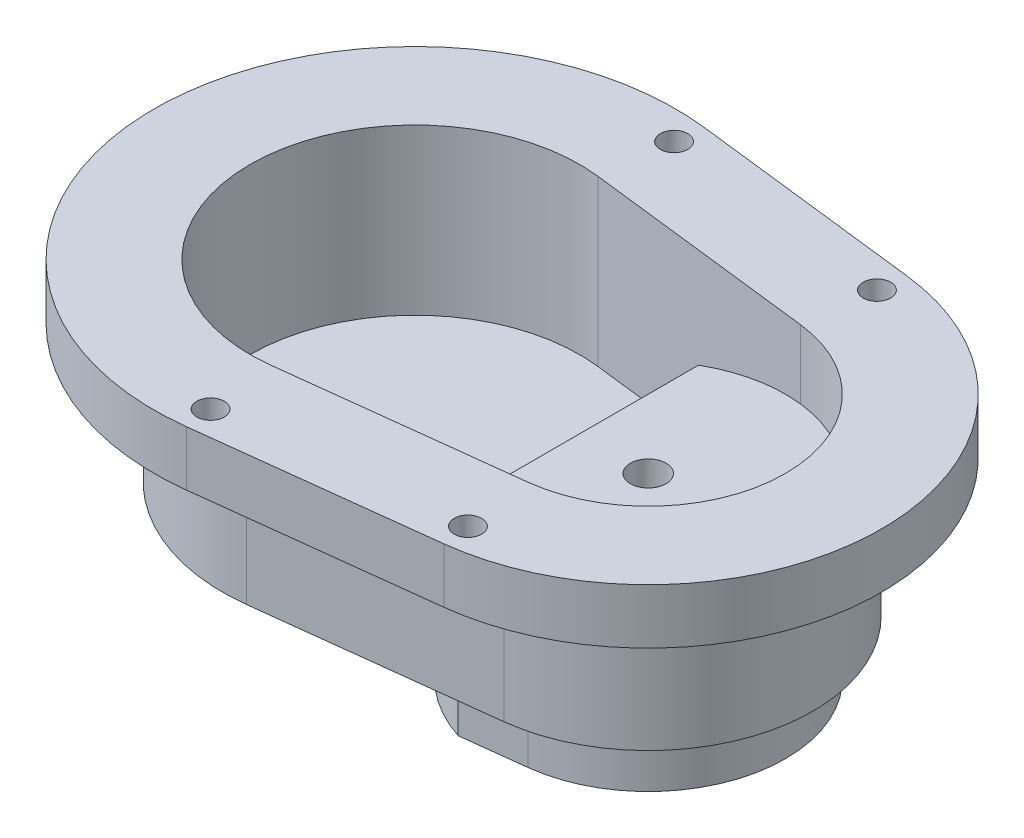
ISO-10303-21;
HEADER;
FILE_DESCRIPTION(('STEP AP214'),'2;1');
FILE_NAME('part.step','',(''),(''),'','','');
FILE_SCHEMA(('AUTOMOTIVE_DESIGN { 1 0 10303 214 1 1 1 1 }'));
ENDSEC;
DATA;
#1=APPLICATION_CONTEXT('core data for automotive mechanical design processes');
#2=APPLICATION_PROTOCOL_DEFINITION('international standard','automotive_design',2000,#1);
#3=PRODUCT_CONTEXT('',#1,'mechanical');
#4=PRODUCT('Part','Part','',(#3));
#5=PRODUCT_RELATED_PRODUCT_CATEGORY('part','',(#4));
#6=PRODUCT_DEFINITION_FORMATION('','',#4);
#7=PRODUCT_DEFINITION_CONTEXT('part definition',#1,'design');
#8=PRODUCT_DEFINITION('design','',#6,#7);
#9=PRODUCT_DEFINITION_SHAPE('','',#8);
#10=(LENGTH_UNIT() NAMED_UNIT(*) SI_UNIT(.MILLI.,.METRE.));
#11=(NAMED_UNIT(*) PLANE_ANGLE_UNIT() SI_UNIT($,.RADIAN.));
#12=(NAMED_UNIT(*) SI_UNIT($,.STERADIAN.) SOLID_ANGLE_UNIT());
#13=UNCERTAINTY_MEASURE_WITH_UNIT(LENGTH_MEASURE(1.E-05),#10,'distance_accuracy_value','');
#14=(GEOMETRIC_REPRESENTATION_CONTEXT(3) GLOBAL_UNCERTAINTY_ASSIGNED_CONTEXT((#13)) GLOBAL_UNIT_ASSIGNED_CONTEXT((#10,
#11,#12)) REPRESENTATION_CONTEXT('',''));
#15=CARTESIAN_POINT('',(0.,0.,0.));
#16=DIRECTION('',(0.,0.,1.));
#17=DIRECTION('',(1.,0.,0.));
#18=AXIS2_PLACEMENT_3D('',#15,#16,#17);
#19=CARTESIAN_POINT('',(85.,45.,0.));
#20=DIRECTION('',(0.,-1.,0.));
#21=DIRECTION('',(0.,0.,-1.));
#22=AXIS2_PLACEMENT_3D('',#19,#20,#21);
#23=CYLINDRICAL_SURFACE('',#22,50.);
#24=DIRECTION('',(0.,1.,0.));
#25=VECTOR('',#24,1.);
#26=CARTESIAN_POINT('',(60.0000000000001,-20.001,-43.301270189222));
#27=LINE('',#26,#25);
#28=CARTESIAN_POINT('',(60.0000000000001,25.,-43.301270189222));
#29=VERTEX_POINT('',#28);
#30=CARTESIAN_POINT('',(60.0000000000001,45.,-43.301270189222));
#31=VERTEX_POINT('',#30);
#32=EDGE_CURVE('E68',#29,#31,#27,.T.);
#33=ORIENTED_EDGE('',*,*,#32,.T.);
#34=CARTESIAN_POINT('',(85.,45.,0.));
#35=DIRECTION('',(0.,1.,0.));
#36=DIRECTION('',(0.,0.,1.));
#37=AXIS2_PLACEMENT_3D('',#34,#35,#36);
#38=CIRCLE('',#37,50.);
#39=CARTESIAN_POINT('',(90.8823529411765,45.,-49.6527735768651));
#40=VERTEX_POINT('',#39);
#41=EDGE_CURVE('E428',#40,#31,#38,.T.);
#42=ORIENTED_EDGE('',*,*,#41,.F.);
#43=DIRECTION('',(0.,1.,0.));
#44=VECTOR('',#43,1.);
#45=CARTESIAN_POINT('',(90.8823529411765,-20.,-49.6527735768651));
#46=LINE('',#45,#44);
#47=CARTESIAN_POINT('',(90.8823529411765,25.,-49.6527735768651));
#48=VERTEX_POINT('',#47);
#49=EDGE_CURVE('E76',#48,#40,#46,.T.);
#50=ORIENTED_EDGE('',*,*,#49,.F.);
#51=CARTESIAN_POINT('',(85.,25.,0.));
#52=DIRECTION('',(0.,1.,0.));
#53=DIRECTION('',(0.,0.,1.));
#54=AXIS2_PLACEMENT_3D('',#51,#52,#53);
#55=CIRCLE('',#54,50.);
#56=EDGE_CURVE('E12',#48,#29,#55,.T.);
#57=ORIENTED_EDGE('',*,*,#56,.T.);
#58=EDGE_LOOP('',(#33,#42,#50,#57));
#59=FACE_BOUND('',#58,.T.);
#60=ADVANCED_FACE('F51',(#59),#23,.T.);
#61=DIRECTION('',(0.,1.,0.));
#62=VECTOR('',#61,1.);
#63=CARTESIAN_POINT('',(60.0000000000001,-20.001,43.301270189222));
#64=LINE('',#63,#62);
#65=CARTESIAN_POINT('',(60.0000000000001,25.,43.301270189222));
#66=VERTEX_POINT('',#65);
#67=CARTESIAN_POINT('',(60.0000000000001,45.,43.301270189222));
#68=VERTEX_POINT('',#67);
#69=EDGE_CURVE('E191',#66,#68,#64,.T.);
#70=ORIENTED_EDGE('',*,*,#69,.F.);
#71=CARTESIAN_POINT('',(90.8823529411765,25.,49.6527735768651));
#72=VERTEX_POINT('',#71);
#73=EDGE_CURVE('E61',#66,#72,#55,.T.);
#74=ORIENTED_EDGE('',*,*,#73,.T.);
#75=DIRECTION('',(0.,1.,0.));
#76=VECTOR('',#75,1.);
#77=CARTESIAN_POINT('',(90.8823529411765,-20.,49.6527735768651));
#78=LINE('',#77,#76);
#79=CARTESIAN_POINT('',(90.8823529411765,45.,49.6527735768651));
#80=VERTEX_POINT('',#79);
#81=EDGE_CURVE('E250',#72,#80,#78,.T.);
#82=ORIENTED_EDGE('',*,*,#81,.T.);
#83=EDGE_CURVE('E202',#68,#80,#38,.T.);
#84=ORIENTED_EDGE('',*,*,#83,.F.);
#85=EDGE_LOOP('',(#70,#74,#82,#84));
#86=FACE_BOUND('',#85,.T.);
#87=ADVANCED_FACE('F199',(#86),#23,.T.);
#88=CARTESIAN_POINT('',(0.,45.,0.));
#89=DIRECTION('',(0.,1.,0.));
#90=DIRECTION('',(0.,0.,1.));
#91=AXIS2_PLACEMENT_3D('',#88,#89,#90);
#92=PLANE('',#91);
#93=CARTESIAN_POINT('',(85.,45.,0.));
#94=DIRECTION('',(0.,1.,0.));
#95=DIRECTION('',(0.,0.,1.));
#96=AXIS2_PLACEMENT_3D('',#93,#94,#95);
#97=CIRCLE('',#96,6.5);
#98=CARTESIAN_POINT('',(85.,45.,6.5));
#99=VERTEX_POINT('',#98);
#100=EDGE_CURVE('E438',#99,#99,#97,.T.);
#101=ORIENTED_EDGE('',*,*,#100,.F.);
#102=EDGE_LOOP('',(#101));
#103=FACE_BOUND('',#102,.T.);
#104=ORIENTED_EDGE('',*,*,#41,.T.);
#105=DIRECTION('',(0.,0.,1.));
#106=VECTOR('',#105,1.);
#107=CARTESIAN_POINT('',(60.0000000000001,45.,0.));
#108=LINE('',#107,#106);
#109=EDGE_CURVE('E446',#31,#68,#108,.T.);
#110=ORIENTED_EDGE('',*,*,#109,.T.);
#111=ORIENTED_EDGE('',*,*,#83,.T.);
#112=EDGE_CURVE('E407',#80,#40,#38,.T.);
#113=ORIENTED_EDGE('',*,*,#112,.T.);
#114=EDGE_LOOP('',(#104,#110,#111,#113));
#115=FACE_BOUND('',#114,.T.);
#116=ADVANCED_FACE('F452',(#103,#115),#92,.T.);
#117=CARTESIAN_POINT('',(85.,25.,0.));
#118=DIRECTION('',(0.,1.,0.));
#119=DIRECTION('',(0.,0.,1.));
#120=AXIS2_PLACEMENT_3D('',#117,#118,#119);
#121=PLANE('',#120);
#122=CARTESIAN_POINT('',(85.,25.,0.));
#123=DIRECTION('',(0.,1.,0.));
#124=DIRECTION('',(0.,0.,1.));
#125=AXIS2_PLACEMENT_3D('',#122,#123,#124);
#126=CIRCLE('',#125,6.5);
#127=CARTESIAN_POINT('',(85.,25.,6.5));
#128=VERTEX_POINT('',#127);
#129=EDGE_CURVE('E55',#128,#128,#126,.T.);
#130=ORIENTED_EDGE('',*,*,#129,.T.);
#131=EDGE_LOOP('',(#130));
#132=FACE_BOUND('',#131,.T.);
#133=DIRECTION('',(0.,0.,-1.));
#134=VECTOR('',#133,1.);
#135=CARTESIAN_POINT('',(60.0000000000001,25.,0.));
#136=LINE('',#135,#134);
#137=EDGE_CURVE('E188',#66,#29,#136,.T.);
#138=ORIENTED_EDGE('',*,*,#137,.T.);
#139=ORIENTED_EDGE('',*,*,#56,.F.);
#140=CARTESIAN_POINT('',(85.,25.,0.));
#141=DIRECTION('',(0.,1.,0.));
#142=DIRECTION('',(0.,0.,1.));
#143=AXIS2_PLACEMENT_3D('',#140,#141,#142);
#144=CIRCLE('',#143,50.);
#145=EDGE_CURVE('E208',#72,#48,#144,.T.);
#146=ORIENTED_EDGE('',*,*,#145,.F.);
#147=ORIENTED_EDGE('',*,*,#73,.F.);
#148=EDGE_LOOP('',(#138,#139,#146,#147));
#149=FACE_BOUND('',#148,.T.);
#150=ADVANCED_FACE('F206',(#132,#149),#121,.F.);
#151=CARTESIAN_POINT('',(8.23529411764709,70.,69.5138830076111));
#152=DIRECTION('',(-0.11764705882353,0.,-0.993055471537302));
#153=DIRECTION('',(-0.993055471537302,0.,0.11764705882353));
#154=AXIS2_PLACEMENT_3D('',#151,#152,#153);
#155=PLANE('',#154);
#156=DIRECTION('',(0.993055471537302,0.,-0.11764705882353));
#157=VECTOR('',#156,1.);
#158=CARTESIAN_POINT('',(8.23529411764708,50.,69.5138830076111));
#159=LINE('',#158,#157);
#160=CARTESIAN_POINT('',(8.23529411764708,50.,69.5138830076111));
#161=VERTEX_POINT('',#160);
#162=CARTESIAN_POINT('',(92.0588235294118,50.,59.5833282922381));
#163=VERTEX_POINT('',#162);
#164=EDGE_CURVE('E385',#161,#163,#159,.T.);
#165=ORIENTED_EDGE('',*,*,#164,.F.);
#166=DIRECTION('',(0.,-1.,0.));
#167=VECTOR('',#166,1.);
#168=CARTESIAN_POINT('',(8.23529411764708,70.,69.5138830076111));
#169=LINE('',#168,#167);
#170=CARTESIAN_POINT('',(8.23529411764708,0.,69.5138830076111));
#171=VERTEX_POINT('',#170);
#172=EDGE_CURVE('E221',#161,#171,#169,.T.);
#173=ORIENTED_EDGE('',*,*,#172,.T.);
#174=DIRECTION('',(0.993055471537302,0.,-0.11764705882353));
#175=VECTOR('',#174,1.);
#176=CARTESIAN_POINT('',(8.23529411764709,0.,69.5138830076111));
#177=LINE('',#176,#175);
#178=CARTESIAN_POINT('',(92.0588235294118,0.,59.5833282922381));
#179=VERTEX_POINT('',#178);
#180=EDGE_CURVE('E236',#171,#179,#177,.T.);
#181=ORIENTED_EDGE('',*,*,#180,.T.);
#182=DIRECTION('',(0.,-1.,0.));
#183=VECTOR('',#182,1.);
#184=CARTESIAN_POINT('',(92.0588235294118,70.,59.5833282922381));
#185=LINE('',#184,#183);
#186=EDGE_CURVE('E211',#163,#179,#185,.T.);
#187=ORIENTED_EDGE('',*,*,#186,.F.);
#188=EDGE_LOOP('',(#165,#173,#181,#187));
#189=FACE_BOUND('',#188,.T.);
#190=ADVANCED_FACE('F53',(#189),#155,.F.);
#191=CARTESIAN_POINT('',(85.,70.,0.));
#192=DIRECTION('',(0.,-1.,0.));
#193=DIRECTION('',(0.,0.,-1.));
#194=AXIS2_PLACEMENT_3D('',#191,#192,#193);
#195=CYLINDRICAL_SURFACE('',#194,60.);
#196=CARTESIAN_POINT('',(85.,50.,0.));
#197=DIRECTION('',(0.,1.,0.));
#198=DIRECTION('',(0.,0.,1.));
#199=AXIS2_PLACEMENT_3D('',#196,#197,#198);
#200=CIRCLE('',#199,60.);
#201=CARTESIAN_POINT('',(92.0588235294118,50.,-59.5833282922381));
#202=VERTEX_POINT('',#201);
#203=EDGE_CURVE('E381',#163,#202,#200,.T.);
#204=ORIENTED_EDGE('',*,*,#203,.F.);
#205=ORIENTED_EDGE('',*,*,#186,.T.);
#206=CARTESIAN_POINT('',(85.,0.,0.));
#207=DIRECTION('',(0.,1.,0.));
#208=DIRECTION('',(0.,0.,1.));
#209=AXIS2_PLACEMENT_3D('',#206,#207,#208);
#210=CIRCLE('',#209,60.);
#211=CARTESIAN_POINT('',(92.0588235294118,0.,-59.5833282922381));
#212=VERTEX_POINT('',#211);
#213=EDGE_CURVE('E232',#179,#212,#210,.T.);
#214=ORIENTED_EDGE('',*,*,#213,.T.);
#215=DIRECTION('',(0.,-1.,0.));
#216=VECTOR('',#215,1.);
#217=CARTESIAN_POINT('',(92.0588235294118,70.,-59.5833282922381));
#218=LINE('',#217,#216);
#219=EDGE_CURVE('E213',#202,#212,#218,.T.);
#220=ORIENTED_EDGE('',*,*,#219,.F.);
#221=EDGE_LOOP('',(#204,#205,#214,#220));
#222=FACE_BOUND('',#221,.T.);
#223=ADVANCED_FACE('F724',(#222),#195,.T.);
#224=CARTESIAN_POINT('',(8.23529411764709,70.,-69.5138830076112));
#225=DIRECTION('',(0.11764705882353,0.,-0.993055471537302));
#226=DIRECTION('',(-0.993055471537302,0.,-0.11764705882353));
#227=AXIS2_PLACEMENT_3D('',#224,#225,#226);
#228=PLANE('',#227);
#229=DIRECTION('',(0.,-1.,0.));
#230=VECTOR('',#229,1.);
#231=CARTESIAN_POINT('',(8.23529411764708,70.,-69.5138830076112));
#232=LINE('',#231,#230);
#233=CARTESIAN_POINT('',(8.23529411764708,50.,-69.5138830076112));
#234=VERTEX_POINT('',#233);
#235=CARTESIAN_POINT('',(8.23529411764708,0.,-69.5138830076112));
#236=VERTEX_POINT('',#235);
#237=EDGE_CURVE('E218',#234,#236,#232,.T.);
#238=ORIENTED_EDGE('',*,*,#237,.F.);
#239=DIRECTION('',(-0.993055471537302,0.,-0.11764705882353));
#240=VECTOR('',#239,1.);
#241=CARTESIAN_POINT('',(8.23529411764708,50.,-69.5138830076112));
#242=LINE('',#241,#240);
#243=EDGE_CURVE('E363',#202,#234,#242,.T.);
#244=ORIENTED_EDGE('',*,*,#243,.F.);
#245=ORIENTED_EDGE('',*,*,#219,.T.);
#246=DIRECTION('',(0.993055471537302,0.,0.11764705882353));
#247=VECTOR('',#246,1.);
#248=CARTESIAN_POINT('',(8.23529411764709,0.,-69.5138830076112));
#249=LINE('',#248,#247);
#250=EDGE_CURVE('E228',#236,#212,#249,.T.);
#251=ORIENTED_EDGE('',*,*,#250,.F.);
#252=EDGE_LOOP('',(#238,#244,#245,#251));
#253=FACE_BOUND('',#252,.T.);
#254=ADVANCED_FACE('F735',(#253),#228,.T.);
#255=CARTESIAN_POINT('',(0.,70.,0.));
#256=DIRECTION('',(0.,-1.,0.));
#257=DIRECTION('',(0.,0.,-1.));
#258=AXIS2_PLACEMENT_3D('',#255,#256,#257);
#259=CYLINDRICAL_SURFACE('',#258,70.);
#260=CARTESIAN_POINT('',(0.,50.,0.));
#261=DIRECTION('',(0.,1.,0.));
#262=DIRECTION('',(0.,0.,1.));
#263=AXIS2_PLACEMENT_3D('',#260,#261,#262);
#264=CIRCLE('',#263,70.);
#265=EDGE_CURVE('E389',#234,#161,#264,.T.);
#266=ORIENTED_EDGE('',*,*,#265,.F.);
#267=ORIENTED_EDGE('',*,*,#237,.T.);
#268=CARTESIAN_POINT('',(0.,0.,0.));
#269=DIRECTION('',(0.,1.,0.));
#270=DIRECTION('',(0.,0.,1.));
#271=AXIS2_PLACEMENT_3D('',#268,#269,#270);
#272=CIRCLE('',#271,70.);
#273=EDGE_CURVE('E224',#236,#171,#272,.T.);
#274=ORIENTED_EDGE('',*,*,#273,.T.);
#275=ORIENTED_EDGE('',*,*,#172,.F.);
#276=EDGE_LOOP('',(#266,#267,#274,#275));
#277=FACE_BOUND('',#276,.T.);
#278=ADVANCED_FACE('F745',(#277),#259,.T.);
#279=CARTESIAN_POINT('',(0.,0.,0.));
#280=DIRECTION('',(0.,1.,0.));
#281=DIRECTION('',(0.,0.,1.));
#282=AXIS2_PLACEMENT_3D('',#279,#280,#281);
#283=PLANE('',#282);
#284=CARTESIAN_POINT('',(85.,0.,0.));
#285=DIRECTION('',(0.,-1.,0.));
#286=DIRECTION('',(0.,0.,-1.));
#287=AXIS2_PLACEMENT_3D('',#284,#285,#286);
#288=CIRCLE('',#287,55.);
#289=CARTESIAN_POINT('',(68.1285936031277,0.,52.3484063386038));
#290=VERTEX_POINT('',#289);
#291=CARTESIAN_POINT('',(68.1285936031277,0.,-52.3484063386038));
#292=VERTEX_POINT('',#291);
#293=EDGE_CURVE('E304',#290,#292,#288,.T.);
#294=ORIENTED_EDGE('',*,*,#293,.F.);
#295=DIRECTION('',(0.993055471537302,0.,-0.11764705882353));
#296=VECTOR('',#295,1.);
#297=CARTESIAN_POINT('',(7.05882352941179,0.,59.5833282922381));
#298=LINE('',#297,#296);
#299=CARTESIAN_POINT('',(90.8823529411764,0.,49.6527735768651));
#300=VERTEX_POINT('',#299);
#301=EDGE_CURVE('E308',#290,#300,#298,.T.);
#302=ORIENTED_EDGE('',*,*,#301,.T.);
#303=CARTESIAN_POINT('',(85.,0.,0.));
#304=DIRECTION('',(0.,-1.,0.));
#305=DIRECTION('',(0.,0.,-1.));
#306=AXIS2_PLACEMENT_3D('',#303,#304,#305);
#307=CIRCLE('',#306,50.);
#308=CARTESIAN_POINT('',(90.8823529411765,0.,-49.6527735768651));
#309=VERTEX_POINT('',#308);
#310=EDGE_CURVE('E295',#300,#309,#307,.F.);
#311=ORIENTED_EDGE('',*,*,#310,.T.);
#312=DIRECTION('',(-0.993055471537302,0.,-0.11764705882353));
#313=VECTOR('',#312,1.);
#314=CARTESIAN_POINT('',(7.0588235294118,0.,-59.5833282922382));
#315=LINE('',#314,#313);
#316=EDGE_CURVE('E300',#309,#292,#315,.T.);
#317=ORIENTED_EDGE('',*,*,#316,.T.);
#318=EDGE_LOOP('',(#294,#302,#311,#317));
#319=FACE_BOUND('',#318,.T.);
#320=ORIENTED_EDGE('',*,*,#180,.F.);
#321=ORIENTED_EDGE('',*,*,#273,.F.);
#322=ORIENTED_EDGE('',*,*,#250,.T.);
#323=ORIENTED_EDGE('',*,*,#213,.F.);
#324=EDGE_LOOP('',(#320,#321,#322,#323));
#325=FACE_BOUND('',#324,.T.);
#326=ADVANCED_FACE('F562',(#319,#325),#283,.F.);
#327=CARTESIAN_POINT('',(7.05882352941179,-20.,59.5833282922381));
#328=DIRECTION('',(0.11764705882353,0.,0.993055471537302));
#329=DIRECTION('',(0.993055471537302,0.,-0.11764705882353));
#330=AXIS2_PLACEMENT_3D('',#327,#328,#329);
#331=PLANE('',#330);
#332=ORIENTED_EDGE('',*,*,#301,.F.);
#333=DIRECTION('',(0.,1.,0.));
#334=VECTOR('',#333,1.);
#335=CARTESIAN_POINT('',(68.1285936031277,-20.,52.3484063386038));
#336=LINE('',#335,#334);
#337=CARTESIAN_POINT('',(68.1285936031277,-20.,52.3484063386038));
#338=VERTEX_POINT('',#337);
#339=EDGE_CURVE('E281',#338,#290,#336,.T.);
#340=ORIENTED_EDGE('',*,*,#339,.F.);
#341=DIRECTION('',(0.993055471537302,0.,-0.11764705882353));
#342=VECTOR('',#341,1.);
#343=CARTESIAN_POINT('',(7.05882352941179,-20.,59.5833282922381));
#344=LINE('',#343,#342);
#345=CARTESIAN_POINT('',(90.8823529411764,-20.,49.6527735768651));
#346=VERTEX_POINT('',#345);
#347=EDGE_CURVE('E327',#338,#346,#344,.T.);
#348=ORIENTED_EDGE('',*,*,#347,.T.);
#349=DIRECTION('',(0.,1.,0.));
#350=VECTOR('',#349,1.);
#351=CARTESIAN_POINT('',(90.8823529411764,-20.,49.6527735768651));
#352=LINE('',#351,#350);
#353=EDGE_CURVE('E291',#346,#300,#352,.T.);
#354=ORIENTED_EDGE('',*,*,#353,.T.);
#355=EDGE_LOOP('',(#332,#340,#348,#354));
#356=FACE_BOUND('',#355,.T.);
#357=ADVANCED_FACE('F558',(#356),#331,.T.);
#358=CARTESIAN_POINT('',(85.,-20.,0.));
#359=DIRECTION('',(0.,1.,0.));
#360=DIRECTION('',(0.,0.,1.));
#361=AXIS2_PLACEMENT_3D('',#358,#359,#360);
#362=CYLINDRICAL_SURFACE('',#361,55.);
#363=ORIENTED_EDGE('',*,*,#293,.T.);
#364=DIRECTION('',(0.,1.,0.));
#365=VECTOR('',#364,1.);
#366=CARTESIAN_POINT('',(68.1285936031277,-20.,-52.3484063386038));
#367=LINE('',#366,#365);
#368=CARTESIAN_POINT('',(68.1285936031277,-20.,-52.3484063386038));
#369=VERTEX_POINT('',#368);
#370=EDGE_CURVE('E284',#369,#292,#367,.T.);
#371=ORIENTED_EDGE('',*,*,#370,.F.);
#372=CARTESIAN_POINT('',(85.,-20.,0.));
#373=DIRECTION('',(0.,-1.,0.));
#374=DIRECTION('',(0.,0.,-1.));
#375=AXIS2_PLACEMENT_3D('',#372,#373,#374);
#376=CIRCLE('',#375,55.);
#377=EDGE_CURVE('E324',#338,#369,#376,.T.);
#378=ORIENTED_EDGE('',*,*,#377,.F.);
#379=ORIENTED_EDGE('',*,*,#339,.T.);
#380=EDGE_LOOP('',(#363,#371,#378,#379));
#381=FACE_BOUND('',#380,.T.);
#382=ADVANCED_FACE('F554',(#381),#362,.T.);
#383=CARTESIAN_POINT('',(7.0588235294118,-20.,-59.5833282922382));
#384=DIRECTION('',(0.11764705882353,0.,-0.993055471537302));
#385=DIRECTION('',(-0.993055471537302,0.,-0.11764705882353));
#386=AXIS2_PLACEMENT_3D('',#383,#384,#385);
#387=PLANE('',#386);
#388=ORIENTED_EDGE('',*,*,#316,.F.);
#389=DIRECTION('',(0.,1.,0.));
#390=VECTOR('',#389,1.);
#391=CARTESIAN_POINT('',(90.8823529411765,-20.,-49.6527735768651));
#392=LINE('',#391,#390);
#393=CARTESIAN_POINT('',(90.8823529411765,-20.,-49.6527735768651));
#394=VERTEX_POINT('',#393);
#395=EDGE_CURVE('E287',#394,#309,#392,.T.);
#396=ORIENTED_EDGE('',*,*,#395,.F.);
#397=DIRECTION('',(-0.993055471537302,0.,-0.11764705882353));
#398=VECTOR('',#397,1.);
#399=CARTESIAN_POINT('',(7.0588235294118,-20.,-59.5833282922382));
#400=LINE('',#399,#398);
#401=EDGE_CURVE('E320',#394,#369,#400,.T.);
#402=ORIENTED_EDGE('',*,*,#401,.T.);
#403=ORIENTED_EDGE('',*,*,#370,.T.);
#404=EDGE_LOOP('',(#388,#396,#402,#403));
#405=FACE_BOUND('',#404,.T.);
#406=ADVANCED_FACE('F551',(#405),#387,.T.);
#407=CARTESIAN_POINT('',(85.,-20.,0.));
#408=DIRECTION('',(0.,1.,0.));
#409=DIRECTION('',(0.,0.,1.));
#410=AXIS2_PLACEMENT_3D('',#407,#408,#409);
#411=CYLINDRICAL_SURFACE('',#410,45.);
#412=CARTESIAN_POINT('',(85.,-20.,0.));
#413=DIRECTION('',(0.,-1.,0.));
#414=DIRECTION('',(0.,0.,-1.));
#415=AXIS2_PLACEMENT_3D('',#412,#413,#414);
#416=CIRCLE('',#415,45.);
#417=CARTESIAN_POINT('',(85.,-20.,-45.));
#418=VERTEX_POINT('',#417);
#419=EDGE_CURVE('E299',#418,#418,#416,.T.);
#420=ORIENTED_EDGE('',*,*,#419,.T.);
#421=EDGE_LOOP('',(#420));
#422=FACE_BOUND('',#421,.T.);
#423=CARTESIAN_POINT('',(85.,0.,0.));
#424=DIRECTION('',(0.,-1.,0.));
#425=DIRECTION('',(0.,0.,-1.));
#426=AXIS2_PLACEMENT_3D('',#423,#424,#425);
#427=CIRCLE('',#426,45.);
#428=CARTESIAN_POINT('',(85.,0.,-45.));
#429=VERTEX_POINT('',#428);
#430=EDGE_CURVE('E312',#429,#429,#427,.T.);
#431=ORIENTED_EDGE('',*,*,#430,.F.);
#432=EDGE_LOOP('',(#431));
#433=FACE_BOUND('',#432,.T.);
#434=ADVANCED_FACE('F549',(#422,#433),#411,.F.);
#435=CARTESIAN_POINT('',(85.,-20.,0.));
#436=DIRECTION('',(0.,1.,0.));
#437=DIRECTION('',(0.,0.,1.));
#438=AXIS2_PLACEMENT_3D('',#435,#436,#437);
#439=CYLINDRICAL_SURFACE('',#438,50.);
#440=ORIENTED_EDGE('',*,*,#310,.F.);
#441=ORIENTED_EDGE('',*,*,#353,.F.);
#442=CARTESIAN_POINT('',(85.,-20.,0.));
#443=DIRECTION('',(0.,-1.,0.));
#444=DIRECTION('',(0.,0.,-1.));
#445=AXIS2_PLACEMENT_3D('',#442,#443,#444);
#446=CIRCLE('',#445,50.);
#447=EDGE_CURVE('E294',#346,#394,#446,.F.);
#448=ORIENTED_EDGE('',*,*,#447,.T.);
#449=ORIENTED_EDGE('',*,*,#395,.T.);
#450=EDGE_LOOP('',(#440,#441,#448,#449));
#451=FACE_BOUND('',#450,.T.);
#452=ADVANCED_FACE('F545',(#451),#439,.T.);
#453=CARTESIAN_POINT('',(0.,-20.,0.));
#454=DIRECTION('',(0.,-1.,0.));
#455=DIRECTION('',(0.,0.,-1.));
#456=AXIS2_PLACEMENT_3D('',#453,#454,#455);
#457=PLANE('',#456);
#458=ORIENTED_EDGE('',*,*,#419,.F.);
#459=EDGE_LOOP('',(#458));
#460=FACE_BOUND('',#459,.T.);
#461=ORIENTED_EDGE('',*,*,#347,.F.);
#462=ORIENTED_EDGE('',*,*,#377,.T.);
#463=ORIENTED_EDGE('',*,*,#401,.F.);
#464=ORIENTED_EDGE('',*,*,#447,.F.);
#465=EDGE_LOOP('',(#461,#462,#463,#464));
#466=FACE_BOUND('',#465,.T.);
#467=ADVANCED_FACE('F542',(#460,#466),#457,.T.);
#468=CARTESIAN_POINT('',(85.,0.,0.));
#469=DIRECTION('',(0.,-1.,0.));
#470=DIRECTION('',(0.,0.,-1.));
#471=AXIS2_PLACEMENT_3D('',#468,#469,#470);
#472=CIRCLE('',#471,6.5);
#473=CARTESIAN_POINT('',(85.,0.,-6.5));
#474=VERTEX_POINT('',#473);
#475=EDGE_CURVE('E442',#474,#474,#472,.T.);
#476=ORIENTED_EDGE('',*,*,#475,.F.);
#477=EDGE_LOOP('',(#476));
#478=FACE_BOUND('',#477,.T.);
#479=ORIENTED_EDGE('',*,*,#430,.T.);
#480=EDGE_LOOP('',(#479));
#481=FACE_BOUND('',#480,.T.);
#482=ADVANCED_FACE('F540',(#478,#481),#283,.F.);
#483=CARTESIAN_POINT('',(0.,50.,0.));
#484=DIRECTION('',(0.,1.,0.));
#485=DIRECTION('',(0.,0.,1.));
#486=AXIS2_PLACEMENT_3D('',#483,#484,#485);
#487=CYLINDRICAL_SURFACE('',#486,95.);
#488=CARTESIAN_POINT('',(0.,70.,0.));
#489=DIRECTION('',(0.,1.,0.));
#490=DIRECTION('',(0.,0.,1.));
#491=AXIS2_PLACEMENT_3D('',#488,#489,#490);
#492=CIRCLE('',#491,95.);
#493=CARTESIAN_POINT('',(11.1764705882353,70.,-94.3402697960437));
#494=VERTEX_POINT('',#493);
#495=CARTESIAN_POINT('',(11.1764705882353,70.,94.3402697960437));
#496=VERTEX_POINT('',#495);
#497=EDGE_CURVE('E359',#494,#496,#492,.T.);
#498=ORIENTED_EDGE('',*,*,#497,.F.);
#499=DIRECTION('',(0.,1.,0.));
#500=VECTOR('',#499,1.);
#501=CARTESIAN_POINT('',(11.1764705882353,50.,-94.3402697960437));
#502=LINE('',#501,#500);
#503=CARTESIAN_POINT('',(11.1764705882353,50.,-94.3402697960437));
#504=VERTEX_POINT('',#503);
#505=EDGE_CURVE('E316',#504,#494,#502,.T.);
#506=ORIENTED_EDGE('',*,*,#505,.F.);
#507=CARTESIAN_POINT('',(0.,50.,0.));
#508=DIRECTION('',(0.,1.,0.));
#509=DIRECTION('',(0.,0.,1.));
#510=AXIS2_PLACEMENT_3D('',#507,#508,#509);
#511=CIRCLE('',#510,95.);
#512=CARTESIAN_POINT('',(11.1764705882353,50.,94.3402697960437));
#513=VERTEX_POINT('',#512);
#514=EDGE_CURVE('E350',#504,#513,#511,.T.);
#515=ORIENTED_EDGE('',*,*,#514,.T.);
#516=DIRECTION('',(0.,1.,0.));
#517=VECTOR('',#516,1.);
#518=CARTESIAN_POINT('',(11.1764705882353,50.,94.3402697960437));
#519=LINE('',#518,#517);
#520=EDGE_CURVE('E334',#513,#496,#519,.T.);
#521=ORIENTED_EDGE('',*,*,#520,.T.);
#522=EDGE_LOOP('',(#498,#506,#515,#521));
#523=FACE_BOUND('',#522,.T.);
#524=ADVANCED_FACE('F530',(#523),#487,.T.);
#525=CARTESIAN_POINT('',(11.1764705882353,50.,-94.3402697960437));
#526=DIRECTION('',(0.11764705882353,0.,-0.993055471537302));
#527=DIRECTION('',(-0.993055471537302,0.,-0.11764705882353));
#528=AXIS2_PLACEMENT_3D('',#525,#526,#527);
#529=PLANE('',#528);
#530=DIRECTION('',(-0.993055471537302,0.,-0.11764705882353));
#531=VECTOR('',#530,1.);
#532=CARTESIAN_POINT('',(11.1764705882353,70.,-94.3402697960437));
#533=LINE('',#532,#531);
#534=CARTESIAN_POINT('',(95.,70.,-84.4097150806707));
#535=VERTEX_POINT('',#534);
#536=EDGE_CURVE('E346',#535,#494,#533,.T.);
#537=ORIENTED_EDGE('',*,*,#536,.F.);
#538=DIRECTION('',(0.,1.,0.));
#539=VECTOR('',#538,1.);
#540=CARTESIAN_POINT('',(95.,50.,-84.4097150806707));
#541=LINE('',#540,#539);
#542=CARTESIAN_POINT('',(95.,50.,-84.4097150806707));
#543=VERTEX_POINT('',#542);
#544=EDGE_CURVE('E341',#543,#535,#541,.T.);
#545=ORIENTED_EDGE('',*,*,#544,.F.);
#546=DIRECTION('',(-0.993055471537302,0.,-0.11764705882353));
#547=VECTOR('',#546,1.);
#548=CARTESIAN_POINT('',(11.1764705882353,50.,-94.3402697960437));
#549=LINE('',#548,#547);
#550=EDGE_CURVE('E338',#543,#504,#549,.T.);
#551=ORIENTED_EDGE('',*,*,#550,.T.);
#552=ORIENTED_EDGE('',*,*,#505,.T.);
#553=EDGE_LOOP('',(#537,#545,#551,#552));
#554=FACE_BOUND('',#553,.T.);
#555=ADVANCED_FACE('F526',(#554),#529,.T.);
#556=CARTESIAN_POINT('',(85.,50.,0.));
#557=DIRECTION('',(0.,1.,0.));
#558=DIRECTION('',(0.,0.,1.));
#559=AXIS2_PLACEMENT_3D('',#556,#557,#558);
#560=CYLINDRICAL_SURFACE('',#559,85.);
#561=CARTESIAN_POINT('',(85.,70.,0.));
#562=DIRECTION('',(0.,1.,0.));
#563=DIRECTION('',(0.,0.,1.));
#564=AXIS2_PLACEMENT_3D('',#561,#562,#563);
#565=CIRCLE('',#564,85.);
#566=CARTESIAN_POINT('',(95.,70.,84.4097150806707));
#567=VERTEX_POINT('',#566);
#568=EDGE_CURVE('E351',#567,#535,#565,.T.);
#569=ORIENTED_EDGE('',*,*,#568,.F.);
#570=DIRECTION('',(0.,1.,0.));
#571=VECTOR('',#570,1.);
#572=CARTESIAN_POINT('',(95.,50.,84.4097150806707));
#573=LINE('',#572,#571);
#574=CARTESIAN_POINT('',(95.,50.,84.4097150806707));
#575=VERTEX_POINT('',#574);
#576=EDGE_CURVE('E337',#575,#567,#573,.T.);
#577=ORIENTED_EDGE('',*,*,#576,.F.);
#578=CARTESIAN_POINT('',(85.,50.,0.));
#579=DIRECTION('',(0.,1.,0.));
#580=DIRECTION('',(0.,0.,1.));
#581=AXIS2_PLACEMENT_3D('',#578,#579,#580);
#582=CIRCLE('',#581,85.);
#583=EDGE_CURVE('E367',#575,#543,#582,.T.);
#584=ORIENTED_EDGE('',*,*,#583,.T.);
#585=ORIENTED_EDGE('',*,*,#544,.T.);
#586=EDGE_LOOP('',(#569,#577,#584,#585));
#587=FACE_BOUND('',#586,.T.);
#588=ADVANCED_FACE('F529',(#587),#560,.T.);
#589=CARTESIAN_POINT('',(11.1764705882353,50.,94.3402697960437));
#590=DIRECTION('',(0.11764705882353,0.,0.993055471537302));
#591=DIRECTION('',(0.993055471537302,0.,-0.11764705882353));
#592=AXIS2_PLACEMENT_3D('',#589,#590,#591);
#593=PLANE('',#592);
#594=DIRECTION('',(0.993055471537302,0.,-0.11764705882353));
#595=VECTOR('',#594,1.);
#596=CARTESIAN_POINT('',(11.1764705882353,70.,94.3402697960437));
#597=LINE('',#596,#595);
#598=EDGE_CURVE('E355',#496,#567,#597,.T.);
#599=ORIENTED_EDGE('',*,*,#598,.F.);
#600=ORIENTED_EDGE('',*,*,#520,.F.);
#601=DIRECTION('',(0.993055471537302,0.,-0.11764705882353));
#602=VECTOR('',#601,1.);
#603=CARTESIAN_POINT('',(11.1764705882353,50.,94.3402697960437));
#604=LINE('',#603,#602);
#605=EDGE_CURVE('E371',#513,#575,#604,.T.);
#606=ORIENTED_EDGE('',*,*,#605,.T.);
#607=ORIENTED_EDGE('',*,*,#576,.T.);
#608=EDGE_LOOP('',(#599,#600,#606,#607));
#609=FACE_BOUND('',#608,.T.);
#610=ADVANCED_FACE('F524',(#609),#593,.T.);
#611=CARTESIAN_POINT('',(0.,50.,0.));
#612=DIRECTION('',(0.,1.,0.));
#613=DIRECTION('',(0.,0.,1.));
#614=AXIS2_PLACEMENT_3D('',#611,#612,#613);
#615=PLANE('',#614);
#616=CARTESIAN_POINT('',(93.8235294117647,50.,-74.4791603652977));
#617=DIRECTION('',(0.,-1.,0.));
#618=DIRECTION('',(0.,0.,-1.));
#619=AXIS2_PLACEMENT_3D('',#616,#617,#618);
#620=CIRCLE('',#619,5.00000000000001);
#621=CARTESIAN_POINT('',(93.8235294117647,50.,-79.4791603652977));
#622=VERTEX_POINT('',#621);
#623=EDGE_CURVE('E402',#622,#622,#620,.T.);
#624=ORIENTED_EDGE('',*,*,#623,.F.);
#625=EDGE_LOOP('',(#624));
#626=FACE_BOUND('',#625,.T.);
#627=CARTESIAN_POINT('',(10.,50.,-84.4097150806707));
#628=DIRECTION('',(0.,-1.,0.));
#629=DIRECTION('',(0.,0.,-1.));
#630=AXIS2_PLACEMENT_3D('',#627,#628,#629);
#631=CIRCLE('',#630,5.);
#632=CARTESIAN_POINT('',(10.,50.,-89.4097150806707));
#633=VERTEX_POINT('',#632);
#634=EDGE_CURVE('E411',#633,#633,#631,.T.);
#635=ORIENTED_EDGE('',*,*,#634,.F.);
#636=EDGE_LOOP('',(#635));
#637=FACE_BOUND('',#636,.T.);
#638=CARTESIAN_POINT('',(10.,50.,84.4097150806707));
#639=DIRECTION('',(0.,-1.,0.));
#640=DIRECTION('',(0.,0.,-1.));
#641=AXIS2_PLACEMENT_3D('',#638,#639,#640);
#642=CIRCLE('',#641,5.);
#643=CARTESIAN_POINT('',(10.,50.,79.4097150806707));
#644=VERTEX_POINT('',#643);
#645=EDGE_CURVE('E419',#644,#644,#642,.T.);
#646=ORIENTED_EDGE('',*,*,#645,.F.);
#647=EDGE_LOOP('',(#646));
#648=FACE_BOUND('',#647,.T.);
#649=CARTESIAN_POINT('',(93.8235294117647,50.,74.4791603652976));
#650=DIRECTION('',(0.,-1.,0.));
#651=DIRECTION('',(0.,0.,-1.));
#652=AXIS2_PLACEMENT_3D('',#649,#650,#651);
#653=CIRCLE('',#652,5.00000000000001);
#654=CARTESIAN_POINT('',(93.8235294117647,50.,69.4791603652976));
#655=VERTEX_POINT('',#654);
#656=EDGE_CURVE('E394',#655,#655,#653,.T.);
#657=ORIENTED_EDGE('',*,*,#656,.F.);
#658=EDGE_LOOP('',(#657));
#659=FACE_BOUND('',#658,.T.);
#660=ORIENTED_EDGE('',*,*,#243,.T.);
#661=ORIENTED_EDGE('',*,*,#265,.T.);
#662=ORIENTED_EDGE('',*,*,#164,.T.);
#663=ORIENTED_EDGE('',*,*,#203,.T.);
#664=EDGE_LOOP('',(#660,#661,#662,#663));
#665=FACE_BOUND('',#664,.T.);
#666=ORIENTED_EDGE('',*,*,#514,.F.);
#667=ORIENTED_EDGE('',*,*,#550,.F.);
#668=ORIENTED_EDGE('',*,*,#583,.F.);
#669=ORIENTED_EDGE('',*,*,#605,.F.);
#670=EDGE_LOOP('',(#666,#667,#668,#669));
#671=FACE_BOUND('',#670,.T.);
#672=ADVANCED_FACE('F521',(#626,#637,#648,#659,#665,#671),#615,.F.);
#673=CARTESIAN_POINT('',(85.,10.,0.));
#674=DIRECTION('',(0.,-1.,0.));
#675=DIRECTION('',(0.,0.,-1.));
#676=AXIS2_PLACEMENT_3D('',#673,#674,#675);
#677=PLANE('',#676);
#678=CARTESIAN_POINT('',(85.,10.,0.));
#679=DIRECTION('',(0.,-1.,0.));
#680=DIRECTION('',(0.,0.,-1.));
#681=AXIS2_PLACEMENT_3D('',#678,#679,#680);
#682=CIRCLE('',#681,6.5);
#683=CARTESIAN_POINT('',(85.,10.,-6.5));
#684=VERTEX_POINT('',#683);
#685=EDGE_CURVE('E432',#684,#684,#682,.T.);
#686=ORIENTED_EDGE('',*,*,#685,.T.);
#687=EDGE_LOOP('',(#686));
#688=FACE_BOUND('',#687,.T.);
#689=DIRECTION('',(-0.993055471537302,0.,0.11764705882353));
#690=VECTOR('',#689,1.);
#691=CARTESIAN_POINT('',(7.05882352941178,10.,59.5833282922381));
#692=LINE('',#691,#690);
#693=CARTESIAN_POINT('',(90.8823529411764,10.,49.6527735768651));
#694=VERTEX_POINT('',#693);
#695=CARTESIAN_POINT('',(7.05882352941178,9.99999999999999,59.5833282922381));
#696=VERTEX_POINT('',#695);
#697=EDGE_CURVE('E278',#694,#696,#692,.T.);
#698=ORIENTED_EDGE('',*,*,#697,.F.);
#699=CARTESIAN_POINT('',(85.,10.,0.));
#700=DIRECTION('',(0.,1.,0.));
#701=DIRECTION('',(0.,0.,1.));
#702=AXIS2_PLACEMENT_3D('',#699,#700,#701);
#703=CIRCLE('',#702,50.);
#704=CARTESIAN_POINT('',(90.8823529411765,10.,-49.6527735768651));
#705=VERTEX_POINT('',#704);
#706=EDGE_CURVE('E429',#694,#705,#703,.T.);
#707=ORIENTED_EDGE('',*,*,#706,.T.);
#708=DIRECTION('',(0.993055471537302,0.,0.11764705882353));
#709=VECTOR('',#708,1.);
#710=CARTESIAN_POINT('',(90.8823529411765,10.,-49.6527735768651));
#711=LINE('',#710,#709);
#712=CARTESIAN_POINT('',(7.05882352941178,9.99999999999999,-59.5833282922382));
#713=VERTEX_POINT('',#712);
#714=EDGE_CURVE('E271',#713,#705,#711,.T.);
#715=ORIENTED_EDGE('',*,*,#714,.F.);
#716=CARTESIAN_POINT('',(0.,10.,0.));
#717=DIRECTION('',(0.,-1.,0.));
#718=DIRECTION('',(0.,0.,-1.));
#719=AXIS2_PLACEMENT_3D('',#716,#717,#718);
#720=CIRCLE('',#719,60.);
#721=EDGE_CURVE('E275',#696,#713,#720,.T.);
#722=ORIENTED_EDGE('',*,*,#721,.F.);
#723=EDGE_LOOP('',(#698,#707,#715,#722));
#724=FACE_BOUND('',#723,.T.);
#725=ADVANCED_FACE('F467',(#688,#724),#677,.F.);
#726=CARTESIAN_POINT('',(7.05882352941178,-20.,59.5833282922381));
#727=DIRECTION('',(0.11764705882353,0.,0.993055471537302));
#728=DIRECTION('',(0.993055471537302,0.,-0.11764705882353));
#729=AXIS2_PLACEMENT_3D('',#726,#727,#728);
#730=PLANE('',#729);
#731=ORIENTED_EDGE('',*,*,#697,.T.);
#732=DIRECTION('',(0.,1.,0.));
#733=VECTOR('',#732,1.);
#734=CARTESIAN_POINT('',(7.05882352941178,-20.,59.5833282922381));
#735=LINE('',#734,#733);
#736=CARTESIAN_POINT('',(7.05882352941178,70.,59.5833282922381));
#737=VERTEX_POINT('',#736);
#738=EDGE_CURVE('E241',#696,#737,#735,.T.);
#739=ORIENTED_EDGE('',*,*,#738,.T.);
#740=DIRECTION('',(0.993055471537302,0.,-0.11764705882353));
#741=VECTOR('',#740,1.);
#742=CARTESIAN_POINT('',(7.05882352941178,70.,59.5833282922381));
#743=LINE('',#742,#741);
#744=CARTESIAN_POINT('',(90.8823529411765,70.,49.6527735768651));
#745=VERTEX_POINT('',#744);
#746=EDGE_CURVE('E263',#737,#745,#743,.T.);
#747=ORIENTED_EDGE('',*,*,#746,.T.);
#748=EDGE_CURVE('E244',#80,#745,#78,.T.);
#749=ORIENTED_EDGE('',*,*,#748,.F.);
#750=ORIENTED_EDGE('',*,*,#81,.F.);
#751=EDGE_CURVE('E246',#694,#72,#78,.T.);
#752=ORIENTED_EDGE('',*,*,#751,.F.);
#753=EDGE_LOOP('',(#731,#739,#747,#749,#750,#752));
#754=FACE_BOUND('',#753,.T.);
#755=ADVANCED_FACE('F462',(#754),#730,.F.);
#756=CARTESIAN_POINT('',(85.,-20.,0.));
#757=DIRECTION('',(0.,1.,0.));
#758=DIRECTION('',(0.,0.,1.));
#759=AXIS2_PLACEMENT_3D('',#756,#757,#758);
#760=CYLINDRICAL_SURFACE('',#759,50.);
#761=CARTESIAN_POINT('',(90.8823529411765,70.,-49.6527735768651));
#762=VERTEX_POINT('',#761);
#763=EDGE_CURVE('E249',#40,#762,#46,.T.);
#764=ORIENTED_EDGE('',*,*,#763,.F.);
#765=ORIENTED_EDGE('',*,*,#112,.F.);
#766=ORIENTED_EDGE('',*,*,#748,.T.);
#767=CARTESIAN_POINT('',(85.,70.,0.));
#768=DIRECTION('',(0.,1.,0.));
#769=DIRECTION('',(0.,0.,1.));
#770=AXIS2_PLACEMENT_3D('',#767,#768,#769);
#771=CIRCLE('',#770,50.);
#772=EDGE_CURVE('E259',#745,#762,#771,.T.);
#773=ORIENTED_EDGE('',*,*,#772,.T.);
#774=EDGE_LOOP('',(#764,#765,#766,#773));
#775=FACE_BOUND('',#774,.T.);
#776=ADVANCED_FACE('F484',(#775),#760,.F.);
#777=CARTESIAN_POINT('',(90.8823529411765,-20.,-49.6527735768651));
#778=DIRECTION('',(0.11764705882353,0.,-0.993055471537302));
#779=DIRECTION('',(-0.993055471537302,0.,-0.11764705882353));
#780=AXIS2_PLACEMENT_3D('',#777,#778,#779);
#781=PLANE('',#780);
#782=ORIENTED_EDGE('',*,*,#714,.T.);
#783=EDGE_CURVE('E251',#705,#48,#46,.T.);
#784=ORIENTED_EDGE('',*,*,#783,.T.);
#785=ORIENTED_EDGE('',*,*,#49,.T.);
#786=ORIENTED_EDGE('',*,*,#763,.T.);
#787=DIRECTION('',(-0.993055471537302,0.,-0.11764705882353));
#788=VECTOR('',#787,1.);
#789=CARTESIAN_POINT('',(90.8823529411765,70.,-49.6527735768651));
#790=LINE('',#789,#788);
#791=CARTESIAN_POINT('',(7.05882352941178,70.,-59.5833282922382));
#792=VERTEX_POINT('',#791);
#793=EDGE_CURVE('E245',#762,#792,#790,.T.);
#794=ORIENTED_EDGE('',*,*,#793,.T.);
#795=DIRECTION('',(0.,1.,0.));
#796=VECTOR('',#795,1.);
#797=CARTESIAN_POINT('',(7.05882352941178,-20.,-59.5833282922382));
#798=LINE('',#797,#796);
#799=EDGE_CURVE('E240',#713,#792,#798,.T.);
#800=ORIENTED_EDGE('',*,*,#799,.F.);
#801=EDGE_LOOP('',(#782,#784,#785,#786,#794,#800));
#802=FACE_BOUND('',#801,.T.);
#803=ADVANCED_FACE('F472',(#802),#781,.F.);
#804=CARTESIAN_POINT('',(0.,-20.,0.));
#805=DIRECTION('',(0.,1.,0.));
#806=DIRECTION('',(0.,0.,1.));
#807=AXIS2_PLACEMENT_3D('',#804,#805,#806);
#808=CYLINDRICAL_SURFACE('',#807,60.);
#809=ORIENTED_EDGE('',*,*,#721,.T.);
#810=ORIENTED_EDGE('',*,*,#799,.T.);
#811=CARTESIAN_POINT('',(0.,70.,0.));
#812=DIRECTION('',(0.,1.,0.));
#813=DIRECTION('',(0.,0.,1.));
#814=AXIS2_PLACEMENT_3D('',#811,#812,#813);
#815=CIRCLE('',#814,60.);
#816=EDGE_CURVE('E267',#792,#737,#815,.T.);
#817=ORIENTED_EDGE('',*,*,#816,.T.);
#818=ORIENTED_EDGE('',*,*,#738,.F.);
#819=EDGE_LOOP('',(#809,#810,#817,#818));
#820=FACE_BOUND('',#819,.T.);
#821=ADVANCED_FACE('F471',(#820),#808,.F.);
#822=CARTESIAN_POINT('',(0.,70.,0.));
#823=DIRECTION('',(0.,1.,0.));
#824=DIRECTION('',(0.,0.,1.));
#825=AXIS2_PLACEMENT_3D('',#822,#823,#824);
#826=PLANE('',#825);
#827=CARTESIAN_POINT('',(93.8235294117647,70.,-74.4791603652977));
#828=DIRECTION('',(0.,-1.,0.));
#829=DIRECTION('',(0.,0.,-1.));
#830=AXIS2_PLACEMENT_3D('',#827,#828,#829);
#831=CIRCLE('',#830,5.00000000000001);
#832=CARTESIAN_POINT('',(93.8235294117647,70.,-79.4791603652977));
#833=VERTEX_POINT('',#832);
#834=EDGE_CURVE('E406',#833,#833,#831,.T.);
#835=ORIENTED_EDGE('',*,*,#834,.T.);
#836=EDGE_LOOP('',(#835));
#837=FACE_BOUND('',#836,.T.);
#838=CARTESIAN_POINT('',(10.,70.,-84.4097150806707));
#839=DIRECTION('',(0.,-1.,0.));
#840=DIRECTION('',(0.,0.,-1.));
#841=AXIS2_PLACEMENT_3D('',#838,#839,#840);
#842=CIRCLE('',#841,5.);
#843=CARTESIAN_POINT('',(10.,70.,-89.4097150806707));
#844=VERTEX_POINT('',#843);
#845=EDGE_CURVE('E415',#844,#844,#842,.T.);
#846=ORIENTED_EDGE('',*,*,#845,.T.);
#847=EDGE_LOOP('',(#846));
#848=FACE_BOUND('',#847,.T.);
#849=CARTESIAN_POINT('',(10.,70.,84.4097150806707));
#850=DIRECTION('',(0.,-1.,0.));
#851=DIRECTION('',(0.,0.,-1.));
#852=AXIS2_PLACEMENT_3D('',#849,#850,#851);
#853=CIRCLE('',#852,5.);
#854=CARTESIAN_POINT('',(10.,70.,79.4097150806707));
#855=VERTEX_POINT('',#854);
#856=EDGE_CURVE('E398',#855,#855,#853,.T.);
#857=ORIENTED_EDGE('',*,*,#856,.T.);
#858=EDGE_LOOP('',(#857));
#859=FACE_BOUND('',#858,.T.);
#860=CARTESIAN_POINT('',(93.8235294117647,70.,74.4791603652976));
#861=DIRECTION('',(0.,-1.,0.));
#862=DIRECTION('',(0.,0.,-1.));
#863=AXIS2_PLACEMENT_3D('',#860,#861,#862);
#864=CIRCLE('',#863,5.00000000000001);
#865=CARTESIAN_POINT('',(93.8235294117647,70.,69.4791603652976));
#866=VERTEX_POINT('',#865);
#867=EDGE_CURVE('E393',#866,#866,#864,.T.);
#868=ORIENTED_EDGE('',*,*,#867,.T.);
#869=EDGE_LOOP('',(#868));
#870=FACE_BOUND('',#869,.T.);
#871=ORIENTED_EDGE('',*,*,#816,.F.);
#872=ORIENTED_EDGE('',*,*,#793,.F.);
#873=ORIENTED_EDGE('',*,*,#772,.F.);
#874=ORIENTED_EDGE('',*,*,#746,.F.);
#875=EDGE_LOOP('',(#871,#872,#873,#874));
#876=FACE_BOUND('',#875,.T.);
#877=ORIENTED_EDGE('',*,*,#497,.T.);
#878=ORIENTED_EDGE('',*,*,#598,.T.);
#879=ORIENTED_EDGE('',*,*,#568,.T.);
#880=ORIENTED_EDGE('',*,*,#536,.T.);
#881=EDGE_LOOP('',(#877,#878,#879,#880));
#882=FACE_BOUND('',#881,.T.);
#883=ADVANCED_FACE('F478',(#837,#848,#859,#870,#876,#882),#826,.T.);
#884=CARTESIAN_POINT('',(93.8235294117647,70.,74.4791603652976));
#885=DIRECTION('',(0.,-1.,0.));
#886=DIRECTION('',(0.,0.,-1.));
#887=AXIS2_PLACEMENT_3D('',#884,#885,#886);
#888=CYLINDRICAL_SURFACE('',#887,5.00000000000001);
#889=ORIENTED_EDGE('',*,*,#867,.F.);
#890=EDGE_LOOP('',(#889));
#891=FACE_BOUND('',#890,.T.);
#892=ORIENTED_EDGE('',*,*,#656,.T.);
#893=EDGE_LOOP('',(#892));
#894=FACE_BOUND('',#893,.T.);
#895=ADVANCED_FACE('F509',(#891,#894),#888,.F.);
#896=CARTESIAN_POINT('',(10.,70.,84.4097150806707));
#897=DIRECTION('',(0.,-1.,0.));
#898=DIRECTION('',(0.,0.,-1.));
#899=AXIS2_PLACEMENT_3D('',#896,#897,#898);
#900=CYLINDRICAL_SURFACE('',#899,5.);
#901=ORIENTED_EDGE('',*,*,#856,.F.);
#902=EDGE_LOOP('',(#901));
#903=FACE_BOUND('',#902,.T.);
#904=ORIENTED_EDGE('',*,*,#645,.T.);
#905=EDGE_LOOP('',(#904));
#906=FACE_BOUND('',#905,.T.);
#907=ADVANCED_FACE('F505',(#903,#906),#900,.F.);
#908=CARTESIAN_POINT('',(10.,70.,-84.4097150806707));
#909=DIRECTION('',(0.,-1.,0.));
#910=DIRECTION('',(0.,0.,-1.));
#911=AXIS2_PLACEMENT_3D('',#908,#909,#910);
#912=CYLINDRICAL_SURFACE('',#911,5.);
#913=ORIENTED_EDGE('',*,*,#845,.F.);
#914=EDGE_LOOP('',(#913));
#915=FACE_BOUND('',#914,.T.);
#916=ORIENTED_EDGE('',*,*,#634,.T.);
#917=EDGE_LOOP('',(#916));
#918=FACE_BOUND('',#917,.T.);
#919=ADVANCED_FACE('F508',(#915,#918),#912,.F.);
#920=CARTESIAN_POINT('',(93.8235294117647,70.,-74.4791603652977));
#921=DIRECTION('',(0.,-1.,0.));
#922=DIRECTION('',(0.,0.,-1.));
#923=AXIS2_PLACEMENT_3D('',#920,#921,#922);
#924=CYLINDRICAL_SURFACE('',#923,5.00000000000001);
#925=ORIENTED_EDGE('',*,*,#834,.F.);
#926=EDGE_LOOP('',(#925));
#927=FACE_BOUND('',#926,.T.);
#928=ORIENTED_EDGE('',*,*,#623,.T.);
#929=EDGE_LOOP('',(#928));
#930=FACE_BOUND('',#929,.T.);
#931=ADVANCED_FACE('F513',(#927,#930),#924,.F.);
#932=CARTESIAN_POINT('',(85.,25.,0.));
#933=DIRECTION('',(0.,-1.,0.));
#934=DIRECTION('',(0.,0.,-1.));
#935=AXIS2_PLACEMENT_3D('',#932,#933,#934);
#936=CYLINDRICAL_SURFACE('',#935,50.);
#937=ORIENTED_EDGE('',*,*,#751,.T.);
#938=ORIENTED_EDGE('',*,*,#145,.T.);
#939=ORIENTED_EDGE('',*,*,#783,.F.);
#940=ORIENTED_EDGE('',*,*,#706,.F.);
#941=EDGE_LOOP('',(#937,#938,#939,#940));
#942=FACE_BOUND('',#941,.T.);
#943=ADVANCED_FACE('F458',(#942),#936,.F.);
#944=CARTESIAN_POINT('',(85.,70.,0.));
#945=DIRECTION('',(0.,-1.,0.));
#946=DIRECTION('',(0.,0.,-1.));
#947=AXIS2_PLACEMENT_3D('',#944,#945,#946);
#948=CYLINDRICAL_SURFACE('',#947,6.5);
#949=ORIENTED_EDGE('',*,*,#100,.T.);
#950=EDGE_LOOP('',(#949));
#951=FACE_BOUND('',#950,.T.);
#952=ORIENTED_EDGE('',*,*,#129,.F.);
#953=EDGE_LOOP('',(#952));
#954=FACE_BOUND('',#953,.T.);
#955=ADVANCED_FACE('F576',(#951,#954),#948,.F.);
#956=ORIENTED_EDGE('',*,*,#475,.T.);
#957=EDGE_LOOP('',(#956));
#958=FACE_BOUND('',#957,.T.);
#959=ORIENTED_EDGE('',*,*,#685,.F.);
#960=EDGE_LOOP('',(#959));
#961=FACE_BOUND('',#960,.T.);
#962=ADVANCED_FACE('F574',(#958,#961),#948,.F.);
#963=CARTESIAN_POINT('',(60.0000000000001,-20.001,0.));
#964=DIRECTION('',(-1.,0.,0.));
#965=DIRECTION('',(0.,0.,1.));
#966=AXIS2_PLACEMENT_3D('',#963,#964,#965);
#967=PLANE('',#966);
#968=ORIENTED_EDGE('',*,*,#69,.T.);
#969=ORIENTED_EDGE('',*,*,#109,.F.);
#970=ORIENTED_EDGE('',*,*,#32,.F.);
#971=ORIENTED_EDGE('',*,*,#137,.F.);
#972=EDGE_LOOP('',(#968,#969,#970,#971));
#973=FACE_BOUND('',#972,.T.);
#974=ADVANCED_FACE('F190',(#973),#967,.T.);
#975=CLOSED_SHELL('',(#60,#87,#116,#150,#190,#223,#254,#278,#326,#357,#382,#406,#434,#452,#467,
#482,#524,#555,#588,#610,#672,#725,#755,#776,#803,#821,#883,#895,#907,#919,#931,#943,#955,#962,#974));
#976=MANIFOLD_SOLID_BREP('B2',#975);
#977=ADVANCED_BREP_SHAPE_REPRESENTATION('',(#18,#976),#14);
#978=SHAPE_DEFINITION_REPRESENTATION(#9,#977);
ENDSEC;
END-ISO-10303-21;
